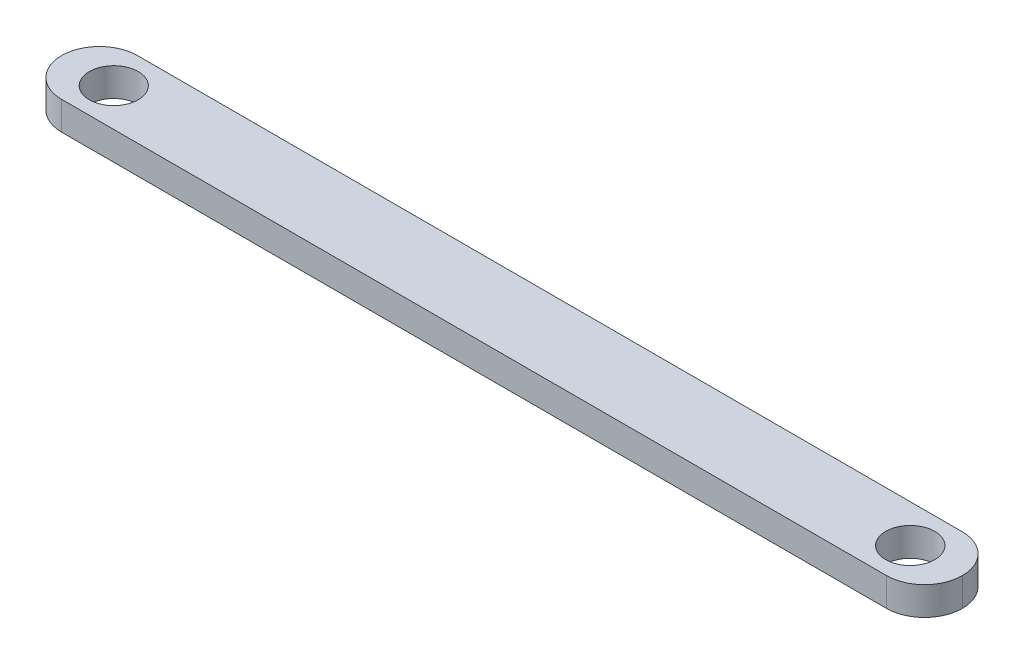
ISO-10303-21;
HEADER;
FILE_DESCRIPTION(('STEP AP214'),'2;1');
FILE_NAME('part.step','',(''),(''),'','','');
FILE_SCHEMA(('AUTOMOTIVE_DESIGN { 1 0 10303 214 1 1 1 1 }'));
ENDSEC;
DATA;
#1=APPLICATION_CONTEXT('core data for automotive mechanical design processes');
#2=APPLICATION_PROTOCOL_DEFINITION('international standard','automotive_design',2000,#1);
#3=PRODUCT_CONTEXT('',#1,'mechanical');
#4=PRODUCT('Part','Part','',(#3));
#5=PRODUCT_RELATED_PRODUCT_CATEGORY('part','',(#4));
#6=PRODUCT_DEFINITION_FORMATION('','',#4);
#7=PRODUCT_DEFINITION_CONTEXT('part definition',#1,'design');
#8=PRODUCT_DEFINITION('design','',#6,#7);
#9=PRODUCT_DEFINITION_SHAPE('','',#8);
#10=(LENGTH_UNIT() NAMED_UNIT(*) SI_UNIT(.MILLI.,.METRE.));
#11=(NAMED_UNIT(*) PLANE_ANGLE_UNIT() SI_UNIT($,.RADIAN.));
#12=(NAMED_UNIT(*) SI_UNIT($,.STERADIAN.) SOLID_ANGLE_UNIT());
#13=UNCERTAINTY_MEASURE_WITH_UNIT(LENGTH_MEASURE(1.E-05),#10,'distance_accuracy_value','');
#14=(GEOMETRIC_REPRESENTATION_CONTEXT(3) GLOBAL_UNCERTAINTY_ASSIGNED_CONTEXT((#13)) GLOBAL_UNIT_ASSIGNED_CONTEXT((#10,
#11,#12)) REPRESENTATION_CONTEXT('',''));
#15=CARTESIAN_POINT('',(0.,0.,0.));
#16=DIRECTION('',(0.,0.,1.));
#17=DIRECTION('',(1.,0.,0.));
#18=AXIS2_PLACEMENT_3D('',#15,#16,#17);
#19=CARTESIAN_POINT('',(0.,3.,0.));
#20=DIRECTION('',(0.,-1.,0.));
#21=DIRECTION('',(0.,0.,-1.));
#22=AXIS2_PLACEMENT_3D('',#19,#20,#21);
#23=PLANE('',#22);
#24=CARTESIAN_POINT('',(43.4,3.,-1.49999999999998));
#25=DIRECTION('',(0.,-1.,0.));
#26=DIRECTION('',(0.,0.,-1.));
#27=AXIS2_PLACEMENT_3D('',#24,#25,#26);
#28=CIRCLE('',#27,4.);
#29=CARTESIAN_POINT('',(43.4,3.,2.50000000000002));
#30=VERTEX_POINT('',#29);
#31=CARTESIAN_POINT('',(47.4,3.,-1.49999999999998));
#32=VERTEX_POINT('',#31);
#33=EDGE_CURVE('E136',#30,#32,#28,.F.);
#34=ORIENTED_EDGE('',*,*,#33,.T.);
#35=CARTESIAN_POINT('',(43.4,3.,-1.49999999999998));
#36=DIRECTION('',(0.,-1.,0.));
#37=DIRECTION('',(0.,0.,-1.));
#38=AXIS2_PLACEMENT_3D('',#35,#36,#37);
#39=CIRCLE('',#38,4.);
#40=CARTESIAN_POINT('',(43.4,3.,-5.49999999999998));
#41=VERTEX_POINT('',#40);
#42=EDGE_CURVE('E143',#32,#41,#39,.F.);
#43=ORIENTED_EDGE('',*,*,#42,.T.);
#44=DIRECTION('',(-1.,0.,0.));
#45=VECTOR('',#44,1.);
#46=CARTESIAN_POINT('',(-47.6,3.,-5.5));
#47=LINE('',#46,#45);
#48=CARTESIAN_POINT('',(-43.6,3.,-5.5));
#49=VERTEX_POINT('',#48);
#50=EDGE_CURVE('E114',#41,#49,#47,.T.);
#51=ORIENTED_EDGE('',*,*,#50,.T.);
#52=CARTESIAN_POINT('',(-43.6,3.,-1.5));
#53=DIRECTION('',(0.,-1.,0.));
#54=DIRECTION('',(0.,0.,-1.));
#55=AXIS2_PLACEMENT_3D('',#52,#53,#54);
#56=CIRCLE('',#55,4.);
#57=CARTESIAN_POINT('',(-47.6,3.,-1.5));
#58=VERTEX_POINT('',#57);
#59=EDGE_CURVE('E139',#49,#58,#56,.F.);
#60=ORIENTED_EDGE('',*,*,#59,.T.);
#61=CARTESIAN_POINT('',(-43.6,3.,-1.5));
#62=DIRECTION('',(0.,-1.,0.));
#63=DIRECTION('',(0.,0.,-1.));
#64=AXIS2_PLACEMENT_3D('',#61,#62,#63);
#65=CIRCLE('',#64,4.);
#66=CARTESIAN_POINT('',(-43.6,3.,2.5));
#67=VERTEX_POINT('',#66);
#68=EDGE_CURVE('E62',#58,#67,#65,.F.);
#69=ORIENTED_EDGE('',*,*,#68,.T.);
#70=DIRECTION('',(1.,0.,0.));
#71=VECTOR('',#70,1.);
#72=CARTESIAN_POINT('',(-47.6,3.,2.5));
#73=LINE('',#72,#71);
#74=EDGE_CURVE('E129',#67,#30,#73,.T.);
#75=ORIENTED_EDGE('',*,*,#74,.T.);
#76=EDGE_LOOP('',(#34,#43,#51,#60,#69,#75));
#77=FACE_BOUND('',#76,.T.);
#78=CARTESIAN_POINT('',(-42.1,3.,-1.5));
#79=DIRECTION('',(0.,1.,0.));
#80=DIRECTION('',(0.,0.,1.));
#81=AXIS2_PLACEMENT_3D('',#78,#79,#80);
#82=CIRCLE('',#81,2.58);
#83=CARTESIAN_POINT('',(-42.1,3.,1.08));
#84=VERTEX_POINT('',#83);
#85=EDGE_CURVE('E124',#84,#84,#82,.T.);
#86=ORIENTED_EDGE('',*,*,#85,.F.);
#87=EDGE_LOOP('',(#86));
#88=FACE_BOUND('',#87,.T.);
#89=CARTESIAN_POINT('',(41.9,3.,-1.50000000000003));
#90=DIRECTION('',(0.,1.,0.));
#91=DIRECTION('',(0.,0.,1.));
#92=AXIS2_PLACEMENT_3D('',#89,#90,#91);
#93=CIRCLE('',#92,2.58999999999999);
#94=CARTESIAN_POINT('',(41.9,3.,1.08999999999997));
#95=VERTEX_POINT('',#94);
#96=EDGE_CURVE('E144',#95,#95,#93,.T.);
#97=ORIENTED_EDGE('',*,*,#96,.F.);
#98=EDGE_LOOP('',(#97));
#99=FACE_BOUND('',#98,.T.);
#100=ADVANCED_FACE('F39',(#77,#88,#99),#23,.F.);
#101=CARTESIAN_POINT('',(0.,0.,0.));
#102=DIRECTION('',(0.,-1.,0.));
#103=DIRECTION('',(0.,0.,-1.));
#104=AXIS2_PLACEMENT_3D('',#101,#102,#103);
#105=PLANE('',#104);
#106=CARTESIAN_POINT('',(-42.1,0.,-1.5));
#107=DIRECTION('',(0.,1.,0.));
#108=DIRECTION('',(0.,0.,1.));
#109=AXIS2_PLACEMENT_3D('',#106,#107,#108);
#110=CIRCLE('',#109,2.58);
#111=CARTESIAN_POINT('',(-42.1,0.,1.08));
#112=VERTEX_POINT('',#111);
#113=EDGE_CURVE('E127',#112,#112,#110,.T.);
#114=ORIENTED_EDGE('',*,*,#113,.T.);
#115=EDGE_LOOP('',(#114));
#116=FACE_BOUND('',#115,.T.);
#117=DIRECTION('',(-1.,0.,0.));
#118=VECTOR('',#117,1.);
#119=CARTESIAN_POINT('',(-47.6,0.,-5.5));
#120=LINE('',#119,#118);
#121=CARTESIAN_POINT('',(43.4,0.,-5.49999999999998));
#122=VERTEX_POINT('',#121);
#123=CARTESIAN_POINT('',(-43.6,0.,-5.5));
#124=VERTEX_POINT('',#123);
#125=EDGE_CURVE('E109',#122,#124,#120,.T.);
#126=ORIENTED_EDGE('',*,*,#125,.F.);
#127=CARTESIAN_POINT('',(43.4,0.,-1.49999999999998));
#128=DIRECTION('',(0.,-1.,0.));
#129=DIRECTION('',(0.,0.,-1.));
#130=AXIS2_PLACEMENT_3D('',#127,#128,#129);
#131=CIRCLE('',#130,4.);
#132=CARTESIAN_POINT('',(47.4,0.,-1.49999999999998));
#133=VERTEX_POINT('',#132);
#134=EDGE_CURVE('E91',#122,#133,#131,.T.);
#135=ORIENTED_EDGE('',*,*,#134,.T.);
#136=CARTESIAN_POINT('',(43.4,0.,-1.49999999999998));
#137=DIRECTION('',(0.,-1.,0.));
#138=DIRECTION('',(0.,0.,-1.));
#139=AXIS2_PLACEMENT_3D('',#136,#137,#138);
#140=CIRCLE('',#139,4.);
#141=CARTESIAN_POINT('',(43.4,0.,2.50000000000002));
#142=VERTEX_POINT('',#141);
#143=EDGE_CURVE('E103',#133,#142,#140,.T.);
#144=ORIENTED_EDGE('',*,*,#143,.T.);
#145=DIRECTION('',(1.,0.,0.));
#146=VECTOR('',#145,1.);
#147=CARTESIAN_POINT('',(-47.6,0.,2.5));
#148=LINE('',#147,#146);
#149=CARTESIAN_POINT('',(-43.6,0.,2.5));
#150=VERTEX_POINT('',#149);
#151=EDGE_CURVE('E122',#150,#142,#148,.T.);
#152=ORIENTED_EDGE('',*,*,#151,.F.);
#153=CARTESIAN_POINT('',(-43.6,0.,-1.5));
#154=DIRECTION('',(0.,-1.,0.));
#155=DIRECTION('',(0.,0.,-1.));
#156=AXIS2_PLACEMENT_3D('',#153,#154,#155);
#157=CIRCLE('',#156,4.);
#158=CARTESIAN_POINT('',(-47.6,0.,-1.5));
#159=VERTEX_POINT('',#158);
#160=EDGE_CURVE('E111',#150,#159,#157,.T.);
#161=ORIENTED_EDGE('',*,*,#160,.T.);
#162=CARTESIAN_POINT('',(-43.6,0.,-1.5));
#163=DIRECTION('',(0.,-1.,0.));
#164=DIRECTION('',(0.,0.,-1.));
#165=AXIS2_PLACEMENT_3D('',#162,#163,#164);
#166=CIRCLE('',#165,4.);
#167=EDGE_CURVE('E118',#159,#124,#166,.T.);
#168=ORIENTED_EDGE('',*,*,#167,.T.);
#169=EDGE_LOOP('',(#126,#135,#144,#152,#161,#168));
#170=FACE_BOUND('',#169,.T.);
#171=CARTESIAN_POINT('',(41.9,0.,-1.50000000000003));
#172=DIRECTION('',(0.,1.,0.));
#173=DIRECTION('',(0.,0.,1.));
#174=AXIS2_PLACEMENT_3D('',#171,#172,#173);
#175=CIRCLE('',#174,2.58999999999999);
#176=CARTESIAN_POINT('',(41.9,0.,1.08999999999997));
#177=VERTEX_POINT('',#176);
#178=EDGE_CURVE('E141',#177,#177,#175,.T.);
#179=ORIENTED_EDGE('',*,*,#178,.T.);
#180=EDGE_LOOP('',(#179));
#181=FACE_BOUND('',#180,.T.);
#182=ADVANCED_FACE('F119',(#116,#170,#181),#105,.T.);
#183=CARTESIAN_POINT('',(-47.6,3.,-5.5));
#184=DIRECTION('',(0.,0.,1.));
#185=DIRECTION('',(1.,0.,0.));
#186=AXIS2_PLACEMENT_3D('',#183,#184,#185);
#187=PLANE('',#186);
#188=ORIENTED_EDGE('',*,*,#50,.F.);
#189=DIRECTION('',(0.,-1.,0.));
#190=VECTOR('',#189,1.);
#191=CARTESIAN_POINT('',(43.4,3.,-5.49999999999998));
#192=LINE('',#191,#190);
#193=EDGE_CURVE('E100',#41,#122,#192,.T.);
#194=ORIENTED_EDGE('',*,*,#193,.T.);
#195=ORIENTED_EDGE('',*,*,#125,.T.);
#196=DIRECTION('',(0.,-1.,0.));
#197=VECTOR('',#196,1.);
#198=CARTESIAN_POINT('',(-43.6,3.,-5.5));
#199=LINE('',#198,#197);
#200=EDGE_CURVE('E113',#124,#49,#199,.F.);
#201=ORIENTED_EDGE('',*,*,#200,.T.);
#202=EDGE_LOOP('',(#188,#194,#195,#201));
#203=FACE_BOUND('',#202,.T.);
#204=ADVANCED_FACE('F107',(#203),#187,.F.);
#205=CARTESIAN_POINT('',(-47.6,3.,2.5));
#206=DIRECTION('',(0.,0.,-1.));
#207=DIRECTION('',(-1.,0.,0.));
#208=AXIS2_PLACEMENT_3D('',#205,#206,#207);
#209=PLANE('',#208);
#210=ORIENTED_EDGE('',*,*,#151,.T.);
#211=DIRECTION('',(0.,-1.,0.));
#212=VECTOR('',#211,1.);
#213=CARTESIAN_POINT('',(43.4,3.,2.50000000000002));
#214=LINE('',#213,#212);
#215=EDGE_CURVE('E11',#142,#30,#214,.F.);
#216=ORIENTED_EDGE('',*,*,#215,.T.);
#217=ORIENTED_EDGE('',*,*,#74,.F.);
#218=DIRECTION('',(0.,-1.,0.));
#219=VECTOR('',#218,1.);
#220=CARTESIAN_POINT('',(-43.6,3.,2.5));
#221=LINE('',#220,#219);
#222=EDGE_CURVE('E48',#67,#150,#221,.T.);
#223=ORIENTED_EDGE('',*,*,#222,.T.);
#224=EDGE_LOOP('',(#210,#216,#217,#223));
#225=FACE_BOUND('',#224,.T.);
#226=ADVANCED_FACE('F154',(#225),#209,.F.);
#227=CARTESIAN_POINT('',(-42.1,3.,-1.5));
#228=DIRECTION('',(0.,-1.,0.));
#229=DIRECTION('',(0.,0.,-1.));
#230=AXIS2_PLACEMENT_3D('',#227,#228,#229);
#231=CYLINDRICAL_SURFACE('',#230,2.58);
#232=ORIENTED_EDGE('',*,*,#85,.T.);
#233=EDGE_LOOP('',(#232));
#234=FACE_BOUND('',#233,.T.);
#235=ORIENTED_EDGE('',*,*,#113,.F.);
#236=EDGE_LOOP('',(#235));
#237=FACE_BOUND('',#236,.T.);
#238=ADVANCED_FACE('F180',(#234,#237),#231,.F.);
#239=CARTESIAN_POINT('',(41.9,3.,-1.50000000000003));
#240=DIRECTION('',(0.,-1.,0.));
#241=DIRECTION('',(0.,0.,-1.));
#242=AXIS2_PLACEMENT_3D('',#239,#240,#241);
#243=CYLINDRICAL_SURFACE('',#242,2.58999999999999);
#244=ORIENTED_EDGE('',*,*,#96,.T.);
#245=EDGE_LOOP('',(#244));
#246=FACE_BOUND('',#245,.T.);
#247=ORIENTED_EDGE('',*,*,#178,.F.);
#248=EDGE_LOOP('',(#247));
#249=FACE_BOUND('',#248,.T.);
#250=ADVANCED_FACE('F167',(#246,#249),#243,.F.);
#251=CARTESIAN_POINT('',(43.4,3.,-1.49999999999998));
#252=DIRECTION('',(0.,-1.,0.));
#253=DIRECTION('',(0.,0.,-1.));
#254=AXIS2_PLACEMENT_3D('',#251,#252,#253);
#255=CYLINDRICAL_SURFACE('',#254,4.);
#256=DIRECTION('',(0.,-1.,0.));
#257=VECTOR('',#256,1.);
#258=CARTESIAN_POINT('',(47.4,3.,-1.49999999999998));
#259=LINE('',#258,#257);
#260=EDGE_CURVE('E97',#32,#133,#259,.T.);
#261=ORIENTED_EDGE('',*,*,#260,.F.);
#262=ORIENTED_EDGE('',*,*,#33,.F.);
#263=ORIENTED_EDGE('',*,*,#215,.F.);
#264=ORIENTED_EDGE('',*,*,#143,.F.);
#265=EDGE_LOOP('',(#261,#262,#263,#264));
#266=FACE_BOUND('',#265,.T.);
#267=ADVANCED_FACE('F160',(#266),#255,.T.);
#268=CARTESIAN_POINT('',(43.4,3.,-1.49999999999998));
#269=DIRECTION('',(0.,-1.,0.));
#270=DIRECTION('',(0.,0.,-1.));
#271=AXIS2_PLACEMENT_3D('',#268,#269,#270);
#272=CYLINDRICAL_SURFACE('',#271,4.);
#273=ORIENTED_EDGE('',*,*,#42,.F.);
#274=ORIENTED_EDGE('',*,*,#260,.T.);
#275=ORIENTED_EDGE('',*,*,#134,.F.);
#276=ORIENTED_EDGE('',*,*,#193,.F.);
#277=EDGE_LOOP('',(#273,#274,#275,#276));
#278=FACE_BOUND('',#277,.T.);
#279=ADVANCED_FACE('F96',(#278),#272,.T.);
#280=CARTESIAN_POINT('',(-43.6,3.,-1.5));
#281=DIRECTION('',(0.,-1.,0.));
#282=DIRECTION('',(0.,0.,-1.));
#283=AXIS2_PLACEMENT_3D('',#280,#281,#282);
#284=CYLINDRICAL_SURFACE('',#283,4.);
#285=ORIENTED_EDGE('',*,*,#222,.F.);
#286=ORIENTED_EDGE('',*,*,#68,.F.);
#287=DIRECTION('',(0.,-1.,0.));
#288=VECTOR('',#287,1.);
#289=CARTESIAN_POINT('',(-47.6,3.,-1.5));
#290=LINE('',#289,#288);
#291=EDGE_CURVE('E43',#159,#58,#290,.F.);
#292=ORIENTED_EDGE('',*,*,#291,.F.);
#293=ORIENTED_EDGE('',*,*,#160,.F.);
#294=EDGE_LOOP('',(#285,#286,#292,#293));
#295=FACE_BOUND('',#294,.T.);
#296=ADVANCED_FACE('F41',(#295),#284,.T.);
#297=CARTESIAN_POINT('',(-43.6,3.,-1.5));
#298=DIRECTION('',(0.,-1.,0.));
#299=DIRECTION('',(0.,0.,-1.));
#300=AXIS2_PLACEMENT_3D('',#297,#298,#299);
#301=CYLINDRICAL_SURFACE('',#300,4.);
#302=ORIENTED_EDGE('',*,*,#59,.F.);
#303=ORIENTED_EDGE('',*,*,#200,.F.);
#304=ORIENTED_EDGE('',*,*,#167,.F.);
#305=ORIENTED_EDGE('',*,*,#291,.T.);
#306=EDGE_LOOP('',(#302,#303,#304,#305));
#307=FACE_BOUND('',#306,.T.);
#308=ADVANCED_FACE('F147',(#307),#301,.T.);
#309=CLOSED_SHELL('',(#100,#182,#204,#226,#238,#250,#267,#279,#296,#308));
#310=MANIFOLD_SOLID_BREP('B2',#309);
#311=ADVANCED_BREP_SHAPE_REPRESENTATION('',(#18,#310),#14);
#312=SHAPE_DEFINITION_REPRESENTATION(#9,#311);
ENDSEC;
END-ISO-10303-21;
